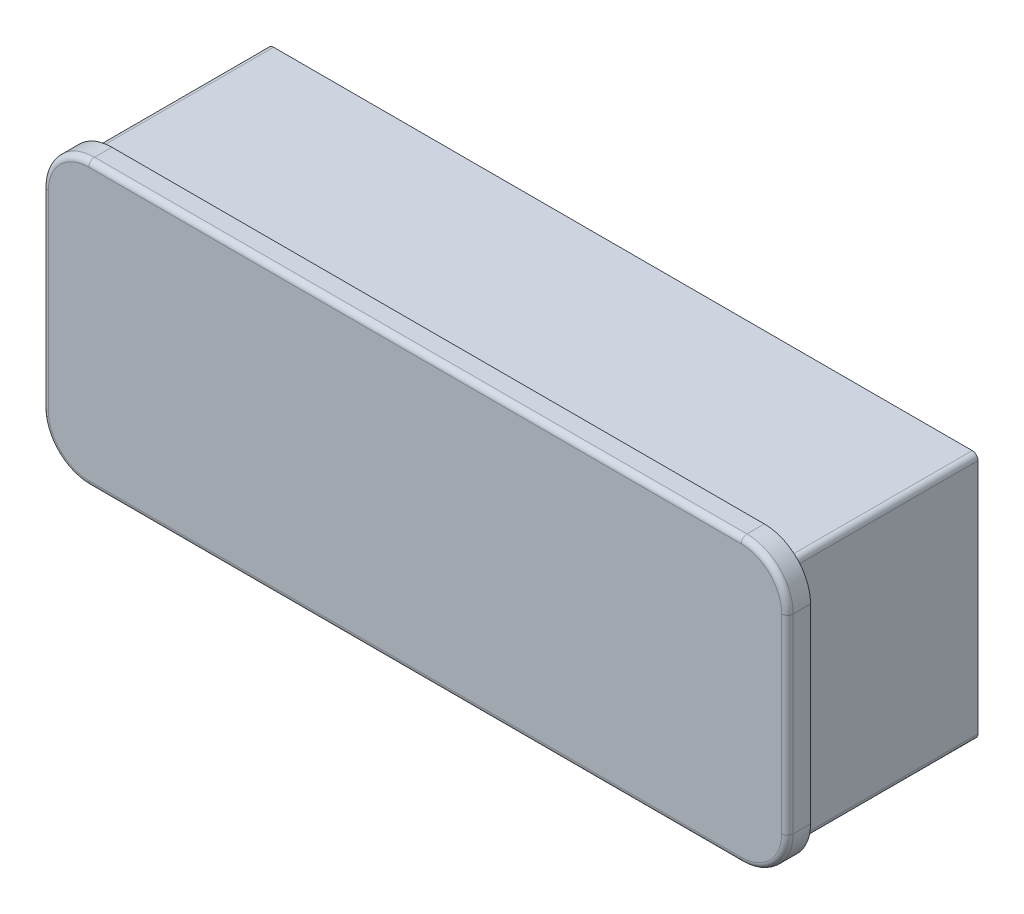
ISO-10303-21;
HEADER;
FILE_DESCRIPTION(('STEP AP214'),'2;1');
FILE_NAME('part.step','',(''),(''),'','','');
FILE_SCHEMA(('AUTOMOTIVE_DESIGN { 1 0 10303 214 1 1 1 1 }'));
ENDSEC;
DATA;
#1=APPLICATION_CONTEXT('core data for automotive mechanical design processes');
#2=APPLICATION_PROTOCOL_DEFINITION('international standard','automotive_design',2000,#1);
#3=PRODUCT_CONTEXT('',#1,'mechanical');
#4=PRODUCT('Part','Part','',(#3));
#5=PRODUCT_RELATED_PRODUCT_CATEGORY('part','',(#4));
#6=PRODUCT_DEFINITION_FORMATION('','',#4);
#7=PRODUCT_DEFINITION_CONTEXT('part definition',#1,'design');
#8=PRODUCT_DEFINITION('design','',#6,#7);
#9=PRODUCT_DEFINITION_SHAPE('','',#8);
#10=(LENGTH_UNIT() NAMED_UNIT(*) SI_UNIT(.MILLI.,.METRE.));
#11=(NAMED_UNIT(*) PLANE_ANGLE_UNIT() SI_UNIT($,.RADIAN.));
#12=(NAMED_UNIT(*) SI_UNIT($,.STERADIAN.) SOLID_ANGLE_UNIT());
#13=UNCERTAINTY_MEASURE_WITH_UNIT(LENGTH_MEASURE(1.E-05),#10,'distance_accuracy_value','');
#14=(GEOMETRIC_REPRESENTATION_CONTEXT(3) GLOBAL_UNCERTAINTY_ASSIGNED_CONTEXT((#13)) GLOBAL_UNIT_ASSIGNED_CONTEXT((#10,
#11,#12)) REPRESENTATION_CONTEXT('',''));
#15=CARTESIAN_POINT('',(0.,0.,0.));
#16=DIRECTION('',(0.,0.,1.));
#17=DIRECTION('',(1.,0.,0.));
#18=AXIS2_PLACEMENT_3D('',#15,#16,#17);
#19=CARTESIAN_POINT('',(0.,0.,0.));
#20=DIRECTION('',(0.,0.,1.));
#21=DIRECTION('',(1.,0.,0.));
#22=AXIS2_PLACEMENT_3D('',#19,#20,#21);
#23=PLANE('',#22);
#24=DIRECTION('',(0.,1.,0.));
#25=VECTOR('',#24,1.);
#26=CARTESIAN_POINT('',(15.373,32.627,0.));
#27=LINE('',#26,#25);
#28=CARTESIAN_POINT('',(15.373,32.877,0.));
#29=VERTEX_POINT('',#28);
#30=CARTESIAN_POINT('',(15.373,43.123,0.));
#31=VERTEX_POINT('',#30);
#32=EDGE_CURVE('E242',#29,#31,#27,.T.);
#33=ORIENTED_EDGE('',*,*,#32,.F.);
#34=CARTESIAN_POINT('',(15.123,32.877,0.));
#35=DIRECTION('',(0.,0.,1.));
#36=DIRECTION('',(1.,0.,0.));
#37=AXIS2_PLACEMENT_3D('',#34,#35,#36);
#38=CIRCLE('',#37,0.25);
#39=CARTESIAN_POINT('',(15.123,32.627,0.));
#40=VERTEX_POINT('',#39);
#41=EDGE_CURVE('E225',#29,#40,#38,.F.);
#42=ORIENTED_EDGE('',*,*,#41,.T.);
#43=DIRECTION('',(1.,0.,0.));
#44=VECTOR('',#43,1.);
#45=CARTESIAN_POINT('',(-15.373,32.627,0.));
#46=LINE('',#45,#44);
#47=CARTESIAN_POINT('',(-15.123,32.627,0.));
#48=VERTEX_POINT('',#47);
#49=EDGE_CURVE('E252',#48,#40,#46,.T.);
#50=ORIENTED_EDGE('',*,*,#49,.F.);
#51=CARTESIAN_POINT('',(-15.123,32.877,0.));
#52=DIRECTION('',(0.,0.,1.));
#53=DIRECTION('',(1.,0.,0.));
#54=AXIS2_PLACEMENT_3D('',#51,#52,#53);
#55=CIRCLE('',#54,0.25);
#56=CARTESIAN_POINT('',(-15.373,32.877,0.));
#57=VERTEX_POINT('',#56);
#58=EDGE_CURVE('E236',#48,#57,#55,.F.);
#59=ORIENTED_EDGE('',*,*,#58,.T.);
#60=DIRECTION('',(0.,-1.,0.));
#61=VECTOR('',#60,1.);
#62=CARTESIAN_POINT('',(-15.373,43.373,0.));
#63=LINE('',#62,#61);
#64=CARTESIAN_POINT('',(-15.373,43.123,0.));
#65=VERTEX_POINT('',#64);
#66=EDGE_CURVE('E257',#65,#57,#63,.T.);
#67=ORIENTED_EDGE('',*,*,#66,.F.);
#68=CARTESIAN_POINT('',(-15.123,43.123,0.));
#69=DIRECTION('',(0.,0.,1.));
#70=DIRECTION('',(1.,0.,0.));
#71=AXIS2_PLACEMENT_3D('',#68,#69,#70);
#72=CIRCLE('',#71,0.25);
#73=CARTESIAN_POINT('',(-15.123,43.373,0.));
#74=VERTEX_POINT('',#73);
#75=EDGE_CURVE('E264',#65,#74,#72,.F.);
#76=ORIENTED_EDGE('',*,*,#75,.T.);
#77=DIRECTION('',(-1.,0.,0.));
#78=VECTOR('',#77,1.);
#79=CARTESIAN_POINT('',(15.373,43.373,0.));
#80=LINE('',#79,#78);
#81=CARTESIAN_POINT('',(15.123,43.373,0.));
#82=VERTEX_POINT('',#81);
#83=EDGE_CURVE('E251',#82,#74,#80,.T.);
#84=ORIENTED_EDGE('',*,*,#83,.F.);
#85=CARTESIAN_POINT('',(15.123,43.123,0.));
#86=DIRECTION('',(0.,0.,1.));
#87=DIRECTION('',(1.,0.,0.));
#88=AXIS2_PLACEMENT_3D('',#85,#86,#87);
#89=CIRCLE('',#88,0.25);
#90=EDGE_CURVE('E246',#82,#31,#89,.F.);
#91=ORIENTED_EDGE('',*,*,#90,.T.);
#92=EDGE_LOOP('',(#33,#42,#50,#59,#67,#76,#84,#91));
#93=FACE_BOUND('',#92,.T.);
#94=DIRECTION('',(1.,0.,0.));
#95=VECTOR('',#94,1.);
#96=CARTESIAN_POINT('',(-14.623,33.377,0.));
#97=LINE('',#96,#95);
#98=CARTESIAN_POINT('',(-13.623,33.377,0.));
#99=VERTEX_POINT('',#98);
#100=CARTESIAN_POINT('',(13.623,33.377,0.));
#101=VERTEX_POINT('',#100);
#102=EDGE_CURVE('E426',#99,#101,#97,.T.);
#103=ORIENTED_EDGE('',*,*,#102,.T.);
#104=CARTESIAN_POINT('',(13.623,34.377,0.));
#105=DIRECTION('',(0.,0.,1.));
#106=DIRECTION('',(1.,0.,0.));
#107=AXIS2_PLACEMENT_3D('',#104,#105,#106);
#108=CIRCLE('',#107,1.);
#109=CARTESIAN_POINT('',(14.623,34.377,0.));
#110=VERTEX_POINT('',#109);
#111=EDGE_CURVE('E346',#101,#110,#108,.T.);
#112=ORIENTED_EDGE('',*,*,#111,.T.);
#113=DIRECTION('',(0.,1.,0.));
#114=VECTOR('',#113,1.);
#115=CARTESIAN_POINT('',(14.623,33.377,0.));
#116=LINE('',#115,#114);
#117=CARTESIAN_POINT('',(14.623,41.623,0.));
#118=VERTEX_POINT('',#117);
#119=EDGE_CURVE('E421',#110,#118,#116,.T.);
#120=ORIENTED_EDGE('',*,*,#119,.T.);
#121=CARTESIAN_POINT('',(13.623,41.623,0.));
#122=DIRECTION('',(0.,0.,1.));
#123=DIRECTION('',(1.,0.,0.));
#124=AXIS2_PLACEMENT_3D('',#121,#122,#123);
#125=CIRCLE('',#124,1.);
#126=CARTESIAN_POINT('',(13.623,42.623,0.));
#127=VERTEX_POINT('',#126);
#128=EDGE_CURVE('E344',#118,#127,#125,.T.);
#129=ORIENTED_EDGE('',*,*,#128,.T.);
#130=DIRECTION('',(-1.,0.,0.));
#131=VECTOR('',#130,1.);
#132=CARTESIAN_POINT('',(14.623,42.623,0.));
#133=LINE('',#132,#131);
#134=CARTESIAN_POINT('',(-13.623,42.623,0.));
#135=VERTEX_POINT('',#134);
#136=EDGE_CURVE('E437',#127,#135,#133,.T.);
#137=ORIENTED_EDGE('',*,*,#136,.T.);
#138=CARTESIAN_POINT('',(-13.623,41.623,0.));
#139=DIRECTION('',(0.,0.,1.));
#140=DIRECTION('',(1.,0.,0.));
#141=AXIS2_PLACEMENT_3D('',#138,#139,#140);
#142=CIRCLE('',#141,1.);
#143=CARTESIAN_POINT('',(-14.623,41.623,0.));
#144=VERTEX_POINT('',#143);
#145=EDGE_CURVE('E342',#135,#144,#142,.T.);
#146=ORIENTED_EDGE('',*,*,#145,.T.);
#147=DIRECTION('',(0.,-1.,0.));
#148=VECTOR('',#147,1.);
#149=CARTESIAN_POINT('',(-14.623,42.623,0.));
#150=LINE('',#149,#148);
#151=CARTESIAN_POINT('',(-14.623,34.377,0.));
#152=VERTEX_POINT('',#151);
#153=EDGE_CURVE('E440',#144,#152,#150,.T.);
#154=ORIENTED_EDGE('',*,*,#153,.T.);
#155=CARTESIAN_POINT('',(-13.623,34.377,0.));
#156=DIRECTION('',(0.,0.,1.));
#157=DIRECTION('',(1.,0.,0.));
#158=AXIS2_PLACEMENT_3D('',#155,#156,#157);
#159=CIRCLE('',#158,1.);
#160=EDGE_CURVE('E348',#152,#99,#159,.T.);
#161=ORIENTED_EDGE('',*,*,#160,.T.);
#162=EDGE_LOOP('',(#103,#112,#120,#129,#137,#146,#154,#161));
#163=FACE_BOUND('',#162,.T.);
#164=ADVANCED_FACE('F38',(#93,#163),#23,.F.);
#165=CARTESIAN_POINT('',(-15.373,43.373,8.));
#166=DIRECTION('',(1.,0.,0.));
#167=DIRECTION('',(0.,0.,-1.));
#168=AXIS2_PLACEMENT_3D('',#165,#166,#167);
#169=PLANE('',#168);
#170=ORIENTED_EDGE('',*,*,#66,.T.);
#171=DIRECTION('',(0.,0.,-1.));
#172=VECTOR('',#171,1.);
#173=CARTESIAN_POINT('',(-15.373,32.877,8.));
#174=LINE('',#173,#172);
#175=CARTESIAN_POINT('',(-15.373,32.877,8.));
#176=VERTEX_POINT('',#175);
#177=EDGE_CURVE('E273',#57,#176,#174,.F.);
#178=ORIENTED_EDGE('',*,*,#177,.T.);
#179=DIRECTION('',(0.,-1.,0.));
#180=VECTOR('',#179,1.);
#181=CARTESIAN_POINT('',(-15.373,43.373,8.));
#182=LINE('',#181,#180);
#183=CARTESIAN_POINT('',(-15.373,43.123,8.));
#184=VERTEX_POINT('',#183);
#185=EDGE_CURVE('E255',#184,#176,#182,.T.);
#186=ORIENTED_EDGE('',*,*,#185,.F.);
#187=DIRECTION('',(0.,0.,-1.));
#188=VECTOR('',#187,1.);
#189=CARTESIAN_POINT('',(-15.373,43.123,8.));
#190=LINE('',#189,#188);
#191=EDGE_CURVE('E270',#184,#65,#190,.T.);
#192=ORIENTED_EDGE('',*,*,#191,.T.);
#193=EDGE_LOOP('',(#170,#178,#186,#192));
#194=FACE_BOUND('',#193,.T.);
#195=ADVANCED_FACE('F456',(#194),#169,.F.);
#196=CARTESIAN_POINT('',(-15.373,32.627,8.));
#197=DIRECTION('',(0.,1.,0.));
#198=DIRECTION('',(0.,0.,1.));
#199=AXIS2_PLACEMENT_3D('',#196,#197,#198);
#200=PLANE('',#199);
#201=ORIENTED_EDGE('',*,*,#49,.T.);
#202=DIRECTION('',(0.,0.,-1.));
#203=VECTOR('',#202,1.);
#204=CARTESIAN_POINT('',(15.123,32.627,8.));
#205=LINE('',#204,#203);
#206=CARTESIAN_POINT('',(15.123,32.627,8.));
#207=VERTEX_POINT('',#206);
#208=EDGE_CURVE('E230',#40,#207,#205,.F.);
#209=ORIENTED_EDGE('',*,*,#208,.T.);
#210=DIRECTION('',(1.,0.,0.));
#211=VECTOR('',#210,1.);
#212=CARTESIAN_POINT('',(-15.373,32.627,8.));
#213=LINE('',#212,#211);
#214=CARTESIAN_POINT('',(-15.123,32.627,8.));
#215=VERTEX_POINT('',#214);
#216=EDGE_CURVE('E447',#215,#207,#213,.T.);
#217=ORIENTED_EDGE('',*,*,#216,.F.);
#218=DIRECTION('',(0.,0.,-1.));
#219=VECTOR('',#218,1.);
#220=CARTESIAN_POINT('',(-15.123,32.627,8.));
#221=LINE('',#220,#219);
#222=EDGE_CURVE('E235',#215,#48,#221,.T.);
#223=ORIENTED_EDGE('',*,*,#222,.T.);
#224=EDGE_LOOP('',(#201,#209,#217,#223));
#225=FACE_BOUND('',#224,.T.);
#226=ADVANCED_FACE('F467',(#225),#200,.F.);
#227=CARTESIAN_POINT('',(15.373,32.627,8.));
#228=DIRECTION('',(-1.,0.,0.));
#229=DIRECTION('',(0.,0.,1.));
#230=AXIS2_PLACEMENT_3D('',#227,#228,#229);
#231=PLANE('',#230);
#232=DIRECTION('',(0.,1.,0.));
#233=VECTOR('',#232,1.);
#234=CARTESIAN_POINT('',(15.373,32.627,8.));
#235=LINE('',#234,#233);
#236=CARTESIAN_POINT('',(15.373,32.877,8.));
#237=VERTEX_POINT('',#236);
#238=CARTESIAN_POINT('',(15.373,43.123,8.));
#239=VERTEX_POINT('',#238);
#240=EDGE_CURVE('E245',#237,#239,#235,.T.);
#241=ORIENTED_EDGE('',*,*,#240,.F.);
#242=DIRECTION('',(0.,0.,-1.));
#243=VECTOR('',#242,1.);
#244=CARTESIAN_POINT('',(15.373,32.877,8.));
#245=LINE('',#244,#243);
#246=EDGE_CURVE('E229',#237,#29,#245,.T.);
#247=ORIENTED_EDGE('',*,*,#246,.T.);
#248=ORIENTED_EDGE('',*,*,#32,.T.);
#249=DIRECTION('',(0.,0.,-1.));
#250=VECTOR('',#249,1.);
#251=CARTESIAN_POINT('',(15.373,43.123,8.));
#252=LINE('',#251,#250);
#253=EDGE_CURVE('E247',#31,#239,#252,.F.);
#254=ORIENTED_EDGE('',*,*,#253,.T.);
#255=EDGE_LOOP('',(#241,#247,#248,#254));
#256=FACE_BOUND('',#255,.T.);
#257=ADVANCED_FACE('F241',(#256),#231,.F.);
#258=CARTESIAN_POINT('',(15.373,43.373,8.));
#259=DIRECTION('',(0.,-1.,0.));
#260=DIRECTION('',(0.,0.,-1.));
#261=AXIS2_PLACEMENT_3D('',#258,#259,#260);
#262=PLANE('',#261);
#263=ORIENTED_EDGE('',*,*,#83,.T.);
#264=DIRECTION('',(0.,0.,-1.));
#265=VECTOR('',#264,1.);
#266=CARTESIAN_POINT('',(-15.123,43.373,8.));
#267=LINE('',#266,#265);
#268=CARTESIAN_POINT('',(-15.123,43.373,8.));
#269=VERTEX_POINT('',#268);
#270=EDGE_CURVE('E278',#74,#269,#267,.F.);
#271=ORIENTED_EDGE('',*,*,#270,.T.);
#272=DIRECTION('',(-1.,0.,0.));
#273=VECTOR('',#272,1.);
#274=CARTESIAN_POINT('',(15.373,43.373,8.));
#275=LINE('',#274,#273);
#276=CARTESIAN_POINT('',(15.123,43.373,8.));
#277=VERTEX_POINT('',#276);
#278=EDGE_CURVE('E261',#277,#269,#275,.T.);
#279=ORIENTED_EDGE('',*,*,#278,.F.);
#280=DIRECTION('',(0.,0.,-1.));
#281=VECTOR('',#280,1.);
#282=CARTESIAN_POINT('',(15.123,43.373,8.));
#283=LINE('',#282,#281);
#284=EDGE_CURVE('E275',#277,#82,#283,.T.);
#285=ORIENTED_EDGE('',*,*,#284,.T.);
#286=EDGE_LOOP('',(#263,#271,#279,#285));
#287=FACE_BOUND('',#286,.T.);
#288=ADVANCED_FACE('F474',(#287),#262,.F.);
#289=CARTESIAN_POINT('',(14.623,33.377,8.));
#290=DIRECTION('',(-1.,0.,0.));
#291=DIRECTION('',(0.,0.,1.));
#292=AXIS2_PLACEMENT_3D('',#289,#290,#291);
#293=PLANE('',#292);
#294=DIRECTION('',(0.,1.,0.));
#295=VECTOR('',#294,1.);
#296=CARTESIAN_POINT('',(14.623,33.377,8.));
#297=LINE('',#296,#295);
#298=CARTESIAN_POINT('',(14.623,34.377,8.));
#299=VERTEX_POINT('',#298);
#300=CARTESIAN_POINT('',(14.623,41.623,8.));
#301=VERTEX_POINT('',#300);
#302=EDGE_CURVE('E422',#299,#301,#297,.T.);
#303=ORIENTED_EDGE('',*,*,#302,.T.);
#304=DIRECTION('',(0.,0.,-1.));
#305=VECTOR('',#304,1.);
#306=CARTESIAN_POINT('',(14.623,41.623,0.));
#307=LINE('',#306,#305);
#308=EDGE_CURVE('E334',#301,#118,#307,.T.);
#309=ORIENTED_EDGE('',*,*,#308,.T.);
#310=ORIENTED_EDGE('',*,*,#119,.F.);
#311=DIRECTION('',(0.,0.,-1.));
#312=VECTOR('',#311,1.);
#313=CARTESIAN_POINT('',(14.623,34.377,8.));
#314=LINE('',#313,#312);
#315=EDGE_CURVE('E332',#110,#299,#314,.F.);
#316=ORIENTED_EDGE('',*,*,#315,.T.);
#317=EDGE_LOOP('',(#303,#309,#310,#316));
#318=FACE_BOUND('',#317,.T.);
#319=ADVANCED_FACE('F483',(#318),#293,.T.);
#320=CARTESIAN_POINT('',(14.623,42.623,8.));
#321=DIRECTION('',(0.,-1.,0.));
#322=DIRECTION('',(1.,0.,0.));
#323=AXIS2_PLACEMENT_3D('',#320,#321,#322);
#324=PLANE('',#323);
#325=DIRECTION('',(-1.,0.,0.));
#326=VECTOR('',#325,1.);
#327=CARTESIAN_POINT('',(14.623,42.623,8.));
#328=LINE('',#327,#326);
#329=CARTESIAN_POINT('',(13.623,42.623,8.));
#330=VERTEX_POINT('',#329);
#331=CARTESIAN_POINT('',(-13.623,42.623,8.));
#332=VERTEX_POINT('',#331);
#333=EDGE_CURVE('E425',#330,#332,#328,.T.);
#334=ORIENTED_EDGE('',*,*,#333,.T.);
#335=DIRECTION('',(0.,0.,-1.));
#336=VECTOR('',#335,1.);
#337=CARTESIAN_POINT('',(-13.623,42.623,0.));
#338=LINE('',#337,#336);
#339=EDGE_CURVE('E316',#332,#135,#338,.T.);
#340=ORIENTED_EDGE('',*,*,#339,.T.);
#341=ORIENTED_EDGE('',*,*,#136,.F.);
#342=DIRECTION('',(0.,0.,-1.));
#343=VECTOR('',#342,1.);
#344=CARTESIAN_POINT('',(13.623,42.623,8.));
#345=LINE('',#344,#343);
#346=EDGE_CURVE('E314',#127,#330,#345,.F.);
#347=ORIENTED_EDGE('',*,*,#346,.T.);
#348=EDGE_LOOP('',(#334,#340,#341,#347));
#349=FACE_BOUND('',#348,.T.);
#350=ADVANCED_FACE('F490',(#349),#324,.T.);
#351=CARTESIAN_POINT('',(-14.623,42.623,8.));
#352=DIRECTION('',(1.,0.,0.));
#353=DIRECTION('',(0.,1.,0.));
#354=AXIS2_PLACEMENT_3D('',#351,#352,#353);
#355=PLANE('',#354);
#356=ORIENTED_EDGE('',*,*,#153,.F.);
#357=DIRECTION('',(0.,0.,-1.));
#358=VECTOR('',#357,1.);
#359=CARTESIAN_POINT('',(-14.623,41.623,8.));
#360=LINE('',#359,#358);
#361=CARTESIAN_POINT('',(-14.623,41.623,8.));
#362=VERTEX_POINT('',#361);
#363=EDGE_CURVE('E322',#144,#362,#360,.F.);
#364=ORIENTED_EDGE('',*,*,#363,.T.);
#365=DIRECTION('',(0.,-1.,0.));
#366=VECTOR('',#365,1.);
#367=CARTESIAN_POINT('',(-14.623,42.623,8.));
#368=LINE('',#367,#366);
#369=CARTESIAN_POINT('',(-14.623,34.377,8.));
#370=VERTEX_POINT('',#369);
#371=EDGE_CURVE('E429',#362,#370,#368,.T.);
#372=ORIENTED_EDGE('',*,*,#371,.T.);
#373=DIRECTION('',(0.,0.,-1.));
#374=VECTOR('',#373,1.);
#375=CARTESIAN_POINT('',(-14.623,34.377,0.));
#376=LINE('',#375,#374);
#377=EDGE_CURVE('E319',#370,#152,#376,.T.);
#378=ORIENTED_EDGE('',*,*,#377,.T.);
#379=EDGE_LOOP('',(#356,#364,#372,#378));
#380=FACE_BOUND('',#379,.T.);
#381=ADVANCED_FACE('F623',(#380),#355,.T.);
#382=CARTESIAN_POINT('',(-14.623,33.377,8.));
#383=DIRECTION('',(0.,1.,0.));
#384=DIRECTION('',(0.,0.,1.));
#385=AXIS2_PLACEMENT_3D('',#382,#383,#384);
#386=PLANE('',#385);
#387=DIRECTION('',(1.,0.,0.));
#388=VECTOR('',#387,1.);
#389=CARTESIAN_POINT('',(-14.623,33.377,8.));
#390=LINE('',#389,#388);
#391=CARTESIAN_POINT('',(-13.623,33.377,8.));
#392=VERTEX_POINT('',#391);
#393=CARTESIAN_POINT('',(13.623,33.377,8.));
#394=VERTEX_POINT('',#393);
#395=EDGE_CURVE('E432',#392,#394,#390,.T.);
#396=ORIENTED_EDGE('',*,*,#395,.T.);
#397=DIRECTION('',(0.,0.,-1.));
#398=VECTOR('',#397,1.);
#399=CARTESIAN_POINT('',(13.623,33.377,0.));
#400=LINE('',#399,#398);
#401=EDGE_CURVE('E339',#394,#101,#400,.T.);
#402=ORIENTED_EDGE('',*,*,#401,.T.);
#403=ORIENTED_EDGE('',*,*,#102,.F.);
#404=DIRECTION('',(0.,0.,-1.));
#405=VECTOR('',#404,1.);
#406=CARTESIAN_POINT('',(-13.623,33.377,8.));
#407=LINE('',#406,#405);
#408=EDGE_CURVE('E337',#99,#392,#407,.F.);
#409=ORIENTED_EDGE('',*,*,#408,.T.);
#410=EDGE_LOOP('',(#396,#402,#403,#409));
#411=FACE_BOUND('',#410,.T.);
#412=ADVANCED_FACE('F619',(#411),#386,.T.);
#413=CARTESIAN_POINT('',(0.,0.,8.));
#414=DIRECTION('',(0.,0.,1.));
#415=DIRECTION('',(1.,0.,0.));
#416=AXIS2_PLACEMENT_3D('',#413,#414,#415);
#417=PLANE('',#416);
#418=ORIENTED_EDGE('',*,*,#371,.F.);
#419=CARTESIAN_POINT('',(-13.623,41.623,8.));
#420=DIRECTION('',(0.,0.,1.));
#421=DIRECTION('',(1.,0.,0.));
#422=AXIS2_PLACEMENT_3D('',#419,#420,#421);
#423=CIRCLE('',#422,1.);
#424=EDGE_CURVE('E330',#362,#332,#423,.F.);
#425=ORIENTED_EDGE('',*,*,#424,.T.);
#426=ORIENTED_EDGE('',*,*,#333,.F.);
#427=CARTESIAN_POINT('',(13.623,41.623,8.));
#428=DIRECTION('',(0.,0.,1.));
#429=DIRECTION('',(1.,0.,0.));
#430=AXIS2_PLACEMENT_3D('',#427,#428,#429);
#431=CIRCLE('',#430,1.);
#432=EDGE_CURVE('E328',#330,#301,#431,.F.);
#433=ORIENTED_EDGE('',*,*,#432,.T.);
#434=ORIENTED_EDGE('',*,*,#302,.F.);
#435=CARTESIAN_POINT('',(13.623,34.377,8.));
#436=DIRECTION('',(0.,0.,1.));
#437=DIRECTION('',(1.,0.,0.));
#438=AXIS2_PLACEMENT_3D('',#435,#436,#437);
#439=CIRCLE('',#438,1.);
#440=EDGE_CURVE('E326',#299,#394,#439,.F.);
#441=ORIENTED_EDGE('',*,*,#440,.T.);
#442=ORIENTED_EDGE('',*,*,#395,.F.);
#443=CARTESIAN_POINT('',(-13.623,34.377,8.));
#444=DIRECTION('',(0.,0.,1.));
#445=DIRECTION('',(1.,0.,0.));
#446=AXIS2_PLACEMENT_3D('',#443,#444,#445);
#447=CIRCLE('',#446,1.);
#448=EDGE_CURVE('E324',#392,#370,#447,.F.);
#449=ORIENTED_EDGE('',*,*,#448,.T.);
#450=EDGE_LOOP('',(#418,#425,#426,#433,#434,#441,#442,#449));
#451=FACE_BOUND('',#450,.T.);
#452=ADVANCED_FACE('F622',(#451),#417,.F.);
#453=DIRECTION('',(-1.,0.,0.));
#454=VECTOR('',#453,1.);
#455=CARTESIAN_POINT('',(16.123,44.123,8.));
#456=LINE('',#455,#454);
#457=CARTESIAN_POINT('',(14.123,44.123,8.));
#458=VERTEX_POINT('',#457);
#459=CARTESIAN_POINT('',(-14.123,44.123,8.));
#460=VERTEX_POINT('',#459);
#461=EDGE_CURVE('E413',#458,#460,#456,.T.);
#462=ORIENTED_EDGE('',*,*,#461,.F.);
#463=CARTESIAN_POINT('',(14.123,42.123,8.));
#464=DIRECTION('',(0.,0.,1.));
#465=DIRECTION('',(1.,0.,0.));
#466=AXIS2_PLACEMENT_3D('',#463,#464,#465);
#467=CIRCLE('',#466,2.);
#468=CARTESIAN_POINT('',(16.123,42.123,8.));
#469=VERTEX_POINT('',#468);
#470=EDGE_CURVE('E298',#458,#469,#467,.F.);
#471=ORIENTED_EDGE('',*,*,#470,.T.);
#472=DIRECTION('',(0.,1.,0.));
#473=VECTOR('',#472,1.);
#474=CARTESIAN_POINT('',(16.123,31.877,8.));
#475=LINE('',#474,#473);
#476=CARTESIAN_POINT('',(16.123,33.877,8.));
#477=VERTEX_POINT('',#476);
#478=EDGE_CURVE('E407',#477,#469,#475,.T.);
#479=ORIENTED_EDGE('',*,*,#478,.F.);
#480=CARTESIAN_POINT('',(14.123,33.877,8.));
#481=DIRECTION('',(0.,0.,1.));
#482=DIRECTION('',(1.,0.,0.));
#483=AXIS2_PLACEMENT_3D('',#480,#481,#482);
#484=CIRCLE('',#483,2.);
#485=CARTESIAN_POINT('',(14.123,31.877,8.));
#486=VERTEX_POINT('',#485);
#487=EDGE_CURVE('E296',#477,#486,#484,.F.);
#488=ORIENTED_EDGE('',*,*,#487,.T.);
#489=DIRECTION('',(1.,0.,0.));
#490=VECTOR('',#489,1.);
#491=CARTESIAN_POINT('',(-16.123,31.877,8.));
#492=LINE('',#491,#490);
#493=CARTESIAN_POINT('',(-14.123,31.877,8.));
#494=VERTEX_POINT('',#493);
#495=EDGE_CURVE('E401',#494,#486,#492,.T.);
#496=ORIENTED_EDGE('',*,*,#495,.F.);
#497=CARTESIAN_POINT('',(-14.123,33.877,8.));
#498=DIRECTION('',(0.,0.,1.));
#499=DIRECTION('',(1.,0.,0.));
#500=AXIS2_PLACEMENT_3D('',#497,#498,#499);
#501=CIRCLE('',#500,2.);
#502=CARTESIAN_POINT('',(-16.123,33.877,8.));
#503=VERTEX_POINT('',#502);
#504=EDGE_CURVE('E294',#494,#503,#501,.F.);
#505=ORIENTED_EDGE('',*,*,#504,.T.);
#506=DIRECTION('',(0.,-1.,0.));
#507=VECTOR('',#506,1.);
#508=CARTESIAN_POINT('',(-16.123,44.123,8.));
#509=LINE('',#508,#507);
#510=CARTESIAN_POINT('',(-16.123,42.123,8.));
#511=VERTEX_POINT('',#510);
#512=EDGE_CURVE('E418',#511,#503,#509,.T.);
#513=ORIENTED_EDGE('',*,*,#512,.F.);
#514=CARTESIAN_POINT('',(-14.123,42.123,8.));
#515=DIRECTION('',(0.,0.,1.));
#516=DIRECTION('',(1.,0.,0.));
#517=AXIS2_PLACEMENT_3D('',#514,#515,#516);
#518=CIRCLE('',#517,2.);
#519=EDGE_CURVE('E292',#511,#460,#518,.F.);
#520=ORIENTED_EDGE('',*,*,#519,.T.);
#521=EDGE_LOOP('',(#462,#471,#479,#488,#496,#505,#513,#520));
#522=FACE_BOUND('',#521,.T.);
#523=ORIENTED_EDGE('',*,*,#240,.T.);
#524=CARTESIAN_POINT('',(15.123,43.123,8.));
#525=DIRECTION('',(0.,0.,1.));
#526=DIRECTION('',(1.,0.,0.));
#527=AXIS2_PLACEMENT_3D('',#524,#525,#526);
#528=CIRCLE('',#527,0.25);
#529=EDGE_CURVE('E286',#239,#277,#528,.T.);
#530=ORIENTED_EDGE('',*,*,#529,.T.);
#531=ORIENTED_EDGE('',*,*,#278,.T.);
#532=CARTESIAN_POINT('',(-15.123,43.123,8.));
#533=DIRECTION('',(0.,0.,1.));
#534=DIRECTION('',(1.,0.,0.));
#535=AXIS2_PLACEMENT_3D('',#532,#533,#534);
#536=CIRCLE('',#535,0.25);
#537=EDGE_CURVE('E284',#269,#184,#536,.T.);
#538=ORIENTED_EDGE('',*,*,#537,.T.);
#539=ORIENTED_EDGE('',*,*,#185,.T.);
#540=CARTESIAN_POINT('',(-15.123,32.877,8.));
#541=DIRECTION('',(0.,0.,1.));
#542=DIRECTION('',(1.,0.,0.));
#543=AXIS2_PLACEMENT_3D('',#540,#541,#542);
#544=CIRCLE('',#543,0.25);
#545=EDGE_CURVE('E282',#176,#215,#544,.T.);
#546=ORIENTED_EDGE('',*,*,#545,.T.);
#547=ORIENTED_EDGE('',*,*,#216,.T.);
#548=CARTESIAN_POINT('',(15.123,32.877,8.));
#549=DIRECTION('',(0.,0.,1.));
#550=DIRECTION('',(1.,0.,0.));
#551=AXIS2_PLACEMENT_3D('',#548,#549,#550);
#552=CIRCLE('',#551,0.25);
#553=EDGE_CURVE('E280',#207,#237,#552,.T.);
#554=ORIENTED_EDGE('',*,*,#553,.T.);
#555=EDGE_LOOP('',(#523,#530,#531,#538,#539,#546,#547,#554));
#556=FACE_BOUND('',#555,.T.);
#557=ADVANCED_FACE('F465',(#522,#556),#417,.F.);
#558=CARTESIAN_POINT('',(-16.123,31.877,9.));
#559=DIRECTION('',(0.,1.,0.));
#560=DIRECTION('',(0.,0.,1.));
#561=AXIS2_PLACEMENT_3D('',#558,#559,#560);
#562=PLANE('',#561);
#563=DIRECTION('',(0.,0.,-1.));
#564=VECTOR('',#563,1.);
#565=CARTESIAN_POINT('',(14.123,31.877,9.));
#566=LINE('',#565,#564);
#567=CARTESIAN_POINT('',(14.123,31.877,8.75));
#568=VERTEX_POINT('',#567);
#569=EDGE_CURVE('E306',#486,#568,#566,.F.);
#570=ORIENTED_EDGE('',*,*,#569,.T.);
#571=DIRECTION('',(1.,0.,0.));
#572=VECTOR('',#571,1.);
#573=CARTESIAN_POINT('',(-14.123,31.877,8.75));
#574=LINE('',#573,#572);
#575=CARTESIAN_POINT('',(-14.123,31.877,8.75));
#576=VERTEX_POINT('',#575);
#577=EDGE_CURVE('E370',#568,#576,#574,.F.);
#578=ORIENTED_EDGE('',*,*,#577,.T.);
#579=DIRECTION('',(0.,0.,-1.));
#580=VECTOR('',#579,1.);
#581=CARTESIAN_POINT('',(-14.123,31.877,9.));
#582=LINE('',#581,#580);
#583=EDGE_CURVE('E304',#576,#494,#582,.T.);
#584=ORIENTED_EDGE('',*,*,#583,.T.);
#585=ORIENTED_EDGE('',*,*,#495,.T.);
#586=EDGE_LOOP('',(#570,#578,#584,#585));
#587=FACE_BOUND('',#586,.T.);
#588=ADVANCED_FACE('F590',(#587),#562,.F.);
#589=CARTESIAN_POINT('',(16.123,31.877,9.));
#590=DIRECTION('',(-1.,0.,0.));
#591=DIRECTION('',(0.,0.,1.));
#592=AXIS2_PLACEMENT_3D('',#589,#590,#591);
#593=PLANE('',#592);
#594=DIRECTION('',(0.,0.,-1.));
#595=VECTOR('',#594,1.);
#596=CARTESIAN_POINT('',(16.123,42.123,9.));
#597=LINE('',#596,#595);
#598=CARTESIAN_POINT('',(16.123,42.123,8.75));
#599=VERTEX_POINT('',#598);
#600=EDGE_CURVE('E302',#469,#599,#597,.F.);
#601=ORIENTED_EDGE('',*,*,#600,.T.);
#602=DIRECTION('',(0.,1.,0.));
#603=VECTOR('',#602,1.);
#604=CARTESIAN_POINT('',(16.123,33.877,8.75));
#605=LINE('',#604,#603);
#606=CARTESIAN_POINT('',(16.123,33.877,8.75));
#607=VERTEX_POINT('',#606);
#608=EDGE_CURVE('E11',#599,#607,#605,.F.);
#609=ORIENTED_EDGE('',*,*,#608,.T.);
#610=DIRECTION('',(0.,0.,-1.));
#611=VECTOR('',#610,1.);
#612=CARTESIAN_POINT('',(16.123,33.877,9.));
#613=LINE('',#612,#611);
#614=EDGE_CURVE('E300',#607,#477,#613,.T.);
#615=ORIENTED_EDGE('',*,*,#614,.T.);
#616=ORIENTED_EDGE('',*,*,#478,.T.);
#617=EDGE_LOOP('',(#601,#609,#615,#616));
#618=FACE_BOUND('',#617,.T.);
#619=ADVANCED_FACE('F580',(#618),#593,.F.);
#620=CARTESIAN_POINT('',(16.123,44.123,9.));
#621=DIRECTION('',(0.,-1.,0.));
#622=DIRECTION('',(0.,0.,-1.));
#623=AXIS2_PLACEMENT_3D('',#620,#621,#622);
#624=PLANE('',#623);
#625=DIRECTION('',(0.,0.,-1.));
#626=VECTOR('',#625,1.);
#627=CARTESIAN_POINT('',(-14.123,44.123,9.));
#628=LINE('',#627,#626);
#629=CARTESIAN_POINT('',(-14.123,44.123,8.75));
#630=VERTEX_POINT('',#629);
#631=EDGE_CURVE('E288',#460,#630,#628,.F.);
#632=ORIENTED_EDGE('',*,*,#631,.T.);
#633=DIRECTION('',(-1.,0.,0.));
#634=VECTOR('',#633,1.);
#635=CARTESIAN_POINT('',(14.123,44.123,8.75));
#636=LINE('',#635,#634);
#637=CARTESIAN_POINT('',(14.123,44.123,8.75));
#638=VERTEX_POINT('',#637);
#639=EDGE_CURVE('E62',#630,#638,#636,.F.);
#640=ORIENTED_EDGE('',*,*,#639,.T.);
#641=DIRECTION('',(0.,0.,-1.));
#642=VECTOR('',#641,1.);
#643=CARTESIAN_POINT('',(14.123,44.123,9.));
#644=LINE('',#643,#642);
#645=EDGE_CURVE('E290',#638,#458,#644,.T.);
#646=ORIENTED_EDGE('',*,*,#645,.T.);
#647=ORIENTED_EDGE('',*,*,#461,.T.);
#648=EDGE_LOOP('',(#632,#640,#646,#647));
#649=FACE_BOUND('',#648,.T.);
#650=ADVANCED_FACE('F605',(#649),#624,.F.);
#651=CARTESIAN_POINT('',(-16.123,44.123,9.));
#652=DIRECTION('',(1.,0.,0.));
#653=DIRECTION('',(0.,0.,-1.));
#654=AXIS2_PLACEMENT_3D('',#651,#652,#653);
#655=PLANE('',#654);
#656=DIRECTION('',(0.,0.,-1.));
#657=VECTOR('',#656,1.);
#658=CARTESIAN_POINT('',(-16.123,33.877,9.));
#659=LINE('',#658,#657);
#660=CARTESIAN_POINT('',(-16.123,33.877,8.75));
#661=VERTEX_POINT('',#660);
#662=EDGE_CURVE('E311',#503,#661,#659,.F.);
#663=ORIENTED_EDGE('',*,*,#662,.T.);
#664=DIRECTION('',(0.,-1.,0.));
#665=VECTOR('',#664,1.);
#666=CARTESIAN_POINT('',(-16.123,42.123,8.75));
#667=LINE('',#666,#665);
#668=CARTESIAN_POINT('',(-16.123,42.123,8.75));
#669=VERTEX_POINT('',#668);
#670=EDGE_CURVE('E374',#661,#669,#667,.F.);
#671=ORIENTED_EDGE('',*,*,#670,.T.);
#672=DIRECTION('',(0.,0.,-1.));
#673=VECTOR('',#672,1.);
#674=CARTESIAN_POINT('',(-16.123,42.123,9.));
#675=LINE('',#674,#673);
#676=EDGE_CURVE('E309',#669,#511,#675,.T.);
#677=ORIENTED_EDGE('',*,*,#676,.T.);
#678=ORIENTED_EDGE('',*,*,#512,.T.);
#679=EDGE_LOOP('',(#663,#671,#677,#678));
#680=FACE_BOUND('',#679,.T.);
#681=ADVANCED_FACE('F598',(#680),#655,.F.);
#682=CARTESIAN_POINT('',(0.,0.,9.));
#683=DIRECTION('',(0.,0.,1.));
#684=DIRECTION('',(1.,0.,0.));
#685=AXIS2_PLACEMENT_3D('',#682,#683,#684);
#686=PLANE('',#685);
#687=DIRECTION('',(1.,0.,0.));
#688=VECTOR('',#687,1.);
#689=CARTESIAN_POINT('',(14.123,32.127,9.));
#690=LINE('',#689,#688);
#691=CARTESIAN_POINT('',(-14.123,32.127,9.));
#692=VERTEX_POINT('',#691);
#693=CARTESIAN_POINT('',(14.123,32.127,9.));
#694=VERTEX_POINT('',#693);
#695=EDGE_CURVE('E362',#692,#694,#690,.T.);
#696=ORIENTED_EDGE('',*,*,#695,.T.);
#697=CARTESIAN_POINT('',(14.123,33.877,9.));
#698=DIRECTION('',(0.,0.,1.));
#699=DIRECTION('',(1.,0.,0.));
#700=AXIS2_PLACEMENT_3D('',#697,#698,#699);
#701=CIRCLE('',#700,1.75);
#702=CARTESIAN_POINT('',(15.873,33.877,9.));
#703=VERTEX_POINT('',#702);
#704=EDGE_CURVE('E364',#694,#703,#701,.T.);
#705=ORIENTED_EDGE('',*,*,#704,.T.);
#706=DIRECTION('',(0.,1.,0.));
#707=VECTOR('',#706,1.);
#708=CARTESIAN_POINT('',(15.873,42.123,9.));
#709=LINE('',#708,#707);
#710=CARTESIAN_POINT('',(15.873,42.123,9.));
#711=VERTEX_POINT('',#710);
#712=EDGE_CURVE('E350',#703,#711,#709,.T.);
#713=ORIENTED_EDGE('',*,*,#712,.T.);
#714=CARTESIAN_POINT('',(14.123,42.123,9.));
#715=DIRECTION('',(0.,0.,1.));
#716=DIRECTION('',(1.,0.,0.));
#717=AXIS2_PLACEMENT_3D('',#714,#715,#716);
#718=CIRCLE('',#717,1.75);
#719=CARTESIAN_POINT('',(14.123,43.873,9.));
#720=VERTEX_POINT('',#719);
#721=EDGE_CURVE('E352',#711,#720,#718,.T.);
#722=ORIENTED_EDGE('',*,*,#721,.T.);
#723=DIRECTION('',(-1.,0.,0.));
#724=VECTOR('',#723,1.);
#725=CARTESIAN_POINT('',(-14.123,43.873,9.));
#726=LINE('',#725,#724);
#727=CARTESIAN_POINT('',(-14.123,43.873,9.));
#728=VERTEX_POINT('',#727);
#729=EDGE_CURVE('E354',#720,#728,#726,.T.);
#730=ORIENTED_EDGE('',*,*,#729,.T.);
#731=CARTESIAN_POINT('',(-14.123,42.123,9.));
#732=DIRECTION('',(0.,0.,1.));
#733=DIRECTION('',(1.,0.,0.));
#734=AXIS2_PLACEMENT_3D('',#731,#732,#733);
#735=CIRCLE('',#734,1.75);
#736=CARTESIAN_POINT('',(-15.873,42.123,9.));
#737=VERTEX_POINT('',#736);
#738=EDGE_CURVE('E356',#728,#737,#735,.T.);
#739=ORIENTED_EDGE('',*,*,#738,.T.);
#740=DIRECTION('',(0.,-1.,0.));
#741=VECTOR('',#740,1.);
#742=CARTESIAN_POINT('',(-15.873,33.877,9.));
#743=LINE('',#742,#741);
#744=CARTESIAN_POINT('',(-15.873,33.877,9.));
#745=VERTEX_POINT('',#744);
#746=EDGE_CURVE('E358',#737,#745,#743,.T.);
#747=ORIENTED_EDGE('',*,*,#746,.T.);
#748=CARTESIAN_POINT('',(-14.123,33.877,9.));
#749=DIRECTION('',(0.,0.,1.));
#750=DIRECTION('',(1.,0.,0.));
#751=AXIS2_PLACEMENT_3D('',#748,#749,#750);
#752=CIRCLE('',#751,1.75);
#753=EDGE_CURVE('E360',#745,#692,#752,.T.);
#754=ORIENTED_EDGE('',*,*,#753,.T.);
#755=EDGE_LOOP('',(#696,#705,#713,#722,#730,#739,#747,#754));
#756=FACE_BOUND('',#755,.T.);
#757=ADVANCED_FACE('F612',(#756),#686,.T.);
#758=CARTESIAN_POINT('',(15.123,32.877,8.));
#759=DIRECTION('',(0.,0.,-1.));
#760=DIRECTION('',(-1.,0.,0.));
#761=AXIS2_PLACEMENT_3D('',#758,#759,#760);
#762=CYLINDRICAL_SURFACE('',#761,0.25);
#763=ORIENTED_EDGE('',*,*,#553,.F.);
#764=ORIENTED_EDGE('',*,*,#208,.F.);
#765=ORIENTED_EDGE('',*,*,#41,.F.);
#766=ORIENTED_EDGE('',*,*,#246,.F.);
#767=EDGE_LOOP('',(#763,#764,#765,#766));
#768=FACE_BOUND('',#767,.T.);
#769=ADVANCED_FACE('F228',(#768),#762,.T.);
#770=CARTESIAN_POINT('',(-15.123,32.877,8.));
#771=DIRECTION('',(0.,0.,-1.));
#772=DIRECTION('',(-1.,0.,0.));
#773=AXIS2_PLACEMENT_3D('',#770,#771,#772);
#774=CYLINDRICAL_SURFACE('',#773,0.25);
#775=ORIENTED_EDGE('',*,*,#545,.F.);
#776=ORIENTED_EDGE('',*,*,#177,.F.);
#777=ORIENTED_EDGE('',*,*,#58,.F.);
#778=ORIENTED_EDGE('',*,*,#222,.F.);
#779=EDGE_LOOP('',(#775,#776,#777,#778));
#780=FACE_BOUND('',#779,.T.);
#781=ADVANCED_FACE('F461',(#780),#774,.T.);
#782=CARTESIAN_POINT('',(-15.123,43.123,8.));
#783=DIRECTION('',(0.,0.,-1.));
#784=DIRECTION('',(-1.,0.,0.));
#785=AXIS2_PLACEMENT_3D('',#782,#783,#784);
#786=CYLINDRICAL_SURFACE('',#785,0.25);
#787=ORIENTED_EDGE('',*,*,#537,.F.);
#788=ORIENTED_EDGE('',*,*,#270,.F.);
#789=ORIENTED_EDGE('',*,*,#75,.F.);
#790=ORIENTED_EDGE('',*,*,#191,.F.);
#791=EDGE_LOOP('',(#787,#788,#789,#790));
#792=FACE_BOUND('',#791,.T.);
#793=ADVANCED_FACE('F497',(#792),#786,.T.);
#794=CARTESIAN_POINT('',(15.123,43.123,8.));
#795=DIRECTION('',(0.,0.,-1.));
#796=DIRECTION('',(-1.,0.,0.));
#797=AXIS2_PLACEMENT_3D('',#794,#795,#796);
#798=CYLINDRICAL_SURFACE('',#797,0.25);
#799=ORIENTED_EDGE('',*,*,#529,.F.);
#800=ORIENTED_EDGE('',*,*,#253,.F.);
#801=ORIENTED_EDGE('',*,*,#90,.F.);
#802=ORIENTED_EDGE('',*,*,#284,.F.);
#803=EDGE_LOOP('',(#799,#800,#801,#802));
#804=FACE_BOUND('',#803,.T.);
#805=ADVANCED_FACE('F500',(#804),#798,.T.);
#806=CARTESIAN_POINT('',(14.123,42.123,9.));
#807=DIRECTION('',(0.,0.,-1.));
#808=DIRECTION('',(-1.,0.,0.));
#809=AXIS2_PLACEMENT_3D('',#806,#807,#808);
#810=CYLINDRICAL_SURFACE('',#809,2.);
#811=ORIENTED_EDGE('',*,*,#645,.F.);
#812=CARTESIAN_POINT('',(14.123,42.123,8.75));
#813=DIRECTION('',(0.,0.,1.));
#814=DIRECTION('',(1.,0.,0.));
#815=AXIS2_PLACEMENT_3D('',#812,#813,#814);
#816=CIRCLE('',#815,2.);
#817=EDGE_CURVE('E47',#638,#599,#816,.F.);
#818=ORIENTED_EDGE('',*,*,#817,.T.);
#819=ORIENTED_EDGE('',*,*,#600,.F.);
#820=ORIENTED_EDGE('',*,*,#470,.F.);
#821=EDGE_LOOP('',(#811,#818,#819,#820));
#822=FACE_BOUND('',#821,.T.);
#823=ADVANCED_FACE('F502',(#822),#810,.T.);
#824=CARTESIAN_POINT('',(14.123,33.877,9.));
#825=DIRECTION('',(0.,0.,-1.));
#826=DIRECTION('',(-1.,0.,0.));
#827=AXIS2_PLACEMENT_3D('',#824,#825,#826);
#828=CYLINDRICAL_SURFACE('',#827,2.);
#829=ORIENTED_EDGE('',*,*,#614,.F.);
#830=CARTESIAN_POINT('',(14.123,33.877,8.75));
#831=DIRECTION('',(0.,0.,1.));
#832=DIRECTION('',(1.,0.,0.));
#833=AXIS2_PLACEMENT_3D('',#830,#831,#832);
#834=CIRCLE('',#833,2.);
#835=EDGE_CURVE('E367',#607,#568,#834,.F.);
#836=ORIENTED_EDGE('',*,*,#835,.T.);
#837=ORIENTED_EDGE('',*,*,#569,.F.);
#838=ORIENTED_EDGE('',*,*,#487,.F.);
#839=EDGE_LOOP('',(#829,#836,#837,#838));
#840=FACE_BOUND('',#839,.T.);
#841=ADVANCED_FACE('F508',(#840),#828,.T.);
#842=CARTESIAN_POINT('',(-14.123,33.877,9.));
#843=DIRECTION('',(0.,0.,-1.));
#844=DIRECTION('',(-1.,0.,0.));
#845=AXIS2_PLACEMENT_3D('',#842,#843,#844);
#846=CYLINDRICAL_SURFACE('',#845,2.);
#847=ORIENTED_EDGE('',*,*,#583,.F.);
#848=CARTESIAN_POINT('',(-14.123,33.877,8.75));
#849=DIRECTION('',(0.,0.,1.));
#850=DIRECTION('',(1.,0.,0.));
#851=AXIS2_PLACEMENT_3D('',#848,#849,#850);
#852=CIRCLE('',#851,2.);
#853=EDGE_CURVE('E372',#576,#661,#852,.F.);
#854=ORIENTED_EDGE('',*,*,#853,.T.);
#855=ORIENTED_EDGE('',*,*,#662,.F.);
#856=ORIENTED_EDGE('',*,*,#504,.F.);
#857=EDGE_LOOP('',(#847,#854,#855,#856));
#858=FACE_BOUND('',#857,.T.);
#859=ADVANCED_FACE('F515',(#858),#846,.T.);
#860=CARTESIAN_POINT('',(-14.123,42.123,9.));
#861=DIRECTION('',(0.,0.,-1.));
#862=DIRECTION('',(-1.,0.,0.));
#863=AXIS2_PLACEMENT_3D('',#860,#861,#862);
#864=CYLINDRICAL_SURFACE('',#863,2.);
#865=ORIENTED_EDGE('',*,*,#676,.F.);
#866=CARTESIAN_POINT('',(-14.123,42.123,8.75));
#867=DIRECTION('',(0.,0.,1.));
#868=DIRECTION('',(1.,0.,0.));
#869=AXIS2_PLACEMENT_3D('',#866,#867,#868);
#870=CIRCLE('',#869,2.);
#871=EDGE_CURVE('E376',#669,#630,#870,.F.);
#872=ORIENTED_EDGE('',*,*,#871,.T.);
#873=ORIENTED_EDGE('',*,*,#631,.F.);
#874=ORIENTED_EDGE('',*,*,#519,.F.);
#875=EDGE_LOOP('',(#865,#872,#873,#874));
#876=FACE_BOUND('',#875,.T.);
#877=ADVANCED_FACE('F519',(#876),#864,.T.);
#878=CARTESIAN_POINT('',(-13.623,41.623,8.));
#879=DIRECTION('',(0.,0.,1.));
#880=DIRECTION('',(1.,0.,0.));
#881=AXIS2_PLACEMENT_3D('',#878,#879,#880);
#882=CYLINDRICAL_SURFACE('',#881,1.);
#883=ORIENTED_EDGE('',*,*,#424,.F.);
#884=ORIENTED_EDGE('',*,*,#363,.F.);
#885=ORIENTED_EDGE('',*,*,#145,.F.);
#886=ORIENTED_EDGE('',*,*,#339,.F.);
#887=EDGE_LOOP('',(#883,#884,#885,#886));
#888=FACE_BOUND('',#887,.T.);
#889=ADVANCED_FACE('F523',(#888),#882,.F.);
#890=CARTESIAN_POINT('',(13.623,41.623,8.));
#891=DIRECTION('',(0.,0.,1.));
#892=DIRECTION('',(1.,0.,0.));
#893=AXIS2_PLACEMENT_3D('',#890,#891,#892);
#894=CYLINDRICAL_SURFACE('',#893,1.);
#895=ORIENTED_EDGE('',*,*,#432,.F.);
#896=ORIENTED_EDGE('',*,*,#346,.F.);
#897=ORIENTED_EDGE('',*,*,#128,.F.);
#898=ORIENTED_EDGE('',*,*,#308,.F.);
#899=EDGE_LOOP('',(#895,#896,#897,#898));
#900=FACE_BOUND('',#899,.T.);
#901=ADVANCED_FACE('F527',(#900),#894,.F.);
#902=CARTESIAN_POINT('',(13.623,34.377,8.));
#903=DIRECTION('',(0.,0.,1.));
#904=DIRECTION('',(1.,0.,0.));
#905=AXIS2_PLACEMENT_3D('',#902,#903,#904);
#906=CYLINDRICAL_SURFACE('',#905,1.);
#907=ORIENTED_EDGE('',*,*,#440,.F.);
#908=ORIENTED_EDGE('',*,*,#315,.F.);
#909=ORIENTED_EDGE('',*,*,#111,.F.);
#910=ORIENTED_EDGE('',*,*,#401,.F.);
#911=EDGE_LOOP('',(#907,#908,#909,#910));
#912=FACE_BOUND('',#911,.T.);
#913=ADVANCED_FACE('F531',(#912),#906,.F.);
#914=CARTESIAN_POINT('',(-13.623,34.377,8.));
#915=DIRECTION('',(0.,0.,1.));
#916=DIRECTION('',(1.,0.,0.));
#917=AXIS2_PLACEMENT_3D('',#914,#915,#916);
#918=CYLINDRICAL_SURFACE('',#917,1.);
#919=ORIENTED_EDGE('',*,*,#448,.F.);
#920=ORIENTED_EDGE('',*,*,#408,.F.);
#921=ORIENTED_EDGE('',*,*,#160,.F.);
#922=ORIENTED_EDGE('',*,*,#377,.F.);
#923=EDGE_LOOP('',(#919,#920,#921,#922));
#924=FACE_BOUND('',#923,.T.);
#925=ADVANCED_FACE('F535',(#924),#918,.F.);
#926=CARTESIAN_POINT('',(-14.123,42.123,8.75));
#927=DIRECTION('',(0.,0.,1.));
#928=DIRECTION('',(1.,0.,0.));
#929=AXIS2_PLACEMENT_3D('',#926,#927,#928);
#930=TOROIDAL_SURFACE('',#929,1.75,0.25);
#931=CARTESIAN_POINT('',(-14.123,43.873,8.75));
#932=DIRECTION('',(1.,0.,0.));
#933=DIRECTION('',(0.,0.,-1.));
#934=AXIS2_PLACEMENT_3D('',#931,#932,#933);
#935=CIRCLE('',#934,0.25);
#936=EDGE_CURVE('E395',#630,#728,#935,.T.);
#937=ORIENTED_EDGE('',*,*,#936,.F.);
#938=ORIENTED_EDGE('',*,*,#871,.F.);
#939=CARTESIAN_POINT('',(-15.873,42.123,8.75));
#940=DIRECTION('',(0.,-1.,0.));
#941=DIRECTION('',(0.,0.,-1.));
#942=AXIS2_PLACEMENT_3D('',#939,#940,#941);
#943=CIRCLE('',#942,0.25);
#944=EDGE_CURVE('E42',#737,#669,#943,.T.);
#945=ORIENTED_EDGE('',*,*,#944,.F.);
#946=ORIENTED_EDGE('',*,*,#738,.F.);
#947=EDGE_LOOP('',(#937,#938,#945,#946));
#948=FACE_BOUND('',#947,.T.);
#949=ADVANCED_FACE('F40',(#948),#930,.T.);
#950=CARTESIAN_POINT('',(-15.873,0.,8.75));
#951=DIRECTION('',(0.,1.,0.));
#952=DIRECTION('',(0.,0.,1.));
#953=AXIS2_PLACEMENT_3D('',#950,#951,#952);
#954=CYLINDRICAL_SURFACE('',#953,0.25);
#955=ORIENTED_EDGE('',*,*,#944,.T.);
#956=ORIENTED_EDGE('',*,*,#670,.F.);
#957=CARTESIAN_POINT('',(-15.873,33.877,8.75));
#958=DIRECTION('',(0.,-1.,0.));
#959=DIRECTION('',(0.,0.,-1.));
#960=AXIS2_PLACEMENT_3D('',#957,#958,#959);
#961=CIRCLE('',#960,0.25);
#962=EDGE_CURVE('E393',#745,#661,#961,.T.);
#963=ORIENTED_EDGE('',*,*,#962,.F.);
#964=ORIENTED_EDGE('',*,*,#746,.F.);
#965=EDGE_LOOP('',(#955,#956,#963,#964));
#966=FACE_BOUND('',#965,.T.);
#967=ADVANCED_FACE('F562',(#966),#954,.T.);
#968=CARTESIAN_POINT('',(0.,43.873,8.75));
#969=DIRECTION('',(1.,0.,0.));
#970=DIRECTION('',(0.,0.,-1.));
#971=AXIS2_PLACEMENT_3D('',#968,#969,#970);
#972=CYLINDRICAL_SURFACE('',#971,0.25);
#973=ORIENTED_EDGE('',*,*,#936,.T.);
#974=ORIENTED_EDGE('',*,*,#729,.F.);
#975=CARTESIAN_POINT('',(14.123,43.873,8.75));
#976=DIRECTION('',(1.,0.,0.));
#977=DIRECTION('',(0.,0.,-1.));
#978=AXIS2_PLACEMENT_3D('',#975,#976,#977);
#979=CIRCLE('',#978,0.25);
#980=EDGE_CURVE('E390',#638,#720,#979,.T.);
#981=ORIENTED_EDGE('',*,*,#980,.F.);
#982=ORIENTED_EDGE('',*,*,#639,.F.);
#983=EDGE_LOOP('',(#973,#974,#981,#982));
#984=FACE_BOUND('',#983,.T.);
#985=ADVANCED_FACE('F559',(#984),#972,.T.);
#986=CARTESIAN_POINT('',(-14.123,33.877,8.75));
#987=DIRECTION('',(0.,0.,1.));
#988=DIRECTION('',(1.,0.,0.));
#989=AXIS2_PLACEMENT_3D('',#986,#987,#988);
#990=TOROIDAL_SURFACE('',#989,1.75,0.25);
#991=ORIENTED_EDGE('',*,*,#962,.T.);
#992=ORIENTED_EDGE('',*,*,#853,.F.);
#993=CARTESIAN_POINT('',(-14.123,32.127,8.75));
#994=DIRECTION('',(1.,0.,0.));
#995=DIRECTION('',(0.,0.,-1.));
#996=AXIS2_PLACEMENT_3D('',#993,#994,#995);
#997=CIRCLE('',#996,0.25);
#998=EDGE_CURVE('E387',#692,#576,#997,.T.);
#999=ORIENTED_EDGE('',*,*,#998,.F.);
#1000=ORIENTED_EDGE('',*,*,#753,.F.);
#1001=EDGE_LOOP('',(#991,#992,#999,#1000));
#1002=FACE_BOUND('',#1001,.T.);
#1003=ADVANCED_FACE('F555',(#1002),#990,.T.);
#1004=CARTESIAN_POINT('',(14.123,42.123,8.75));
#1005=DIRECTION('',(0.,0.,1.));
#1006=DIRECTION('',(1.,0.,0.));
#1007=AXIS2_PLACEMENT_3D('',#1004,#1005,#1006);
#1008=TOROIDAL_SURFACE('',#1007,1.75,0.25);
#1009=ORIENTED_EDGE('',*,*,#980,.T.);
#1010=ORIENTED_EDGE('',*,*,#721,.F.);
#1011=CARTESIAN_POINT('',(15.873,42.123,8.75));
#1012=DIRECTION('',(0.,-1.,0.));
#1013=DIRECTION('',(0.,0.,-1.));
#1014=AXIS2_PLACEMENT_3D('',#1011,#1012,#1013);
#1015=CIRCLE('',#1014,0.25);
#1016=EDGE_CURVE('E384',#599,#711,#1015,.T.);
#1017=ORIENTED_EDGE('',*,*,#1016,.F.);
#1018=ORIENTED_EDGE('',*,*,#817,.F.);
#1019=EDGE_LOOP('',(#1009,#1010,#1017,#1018));
#1020=FACE_BOUND('',#1019,.T.);
#1021=ADVANCED_FACE('F551',(#1020),#1008,.T.);
#1022=CARTESIAN_POINT('',(0.,32.127,8.75));
#1023=DIRECTION('',(-1.,0.,0.));
#1024=DIRECTION('',(0.,0.,1.));
#1025=AXIS2_PLACEMENT_3D('',#1022,#1023,#1024);
#1026=CYLINDRICAL_SURFACE('',#1025,0.25);
#1027=ORIENTED_EDGE('',*,*,#998,.T.);
#1028=ORIENTED_EDGE('',*,*,#577,.F.);
#1029=CARTESIAN_POINT('',(14.123,32.127,8.75));
#1030=DIRECTION('',(1.,0.,0.));
#1031=DIRECTION('',(0.,0.,-1.));
#1032=AXIS2_PLACEMENT_3D('',#1029,#1030,#1031);
#1033=CIRCLE('',#1032,0.25);
#1034=EDGE_CURVE('E382',#694,#568,#1033,.T.);
#1035=ORIENTED_EDGE('',*,*,#1034,.F.);
#1036=ORIENTED_EDGE('',*,*,#695,.F.);
#1037=EDGE_LOOP('',(#1027,#1028,#1035,#1036));
#1038=FACE_BOUND('',#1037,.T.);
#1039=ADVANCED_FACE('F547',(#1038),#1026,.T.);
#1040=CARTESIAN_POINT('',(15.873,0.,8.75));
#1041=DIRECTION('',(0.,-1.,0.));
#1042=DIRECTION('',(0.,0.,-1.));
#1043=AXIS2_PLACEMENT_3D('',#1040,#1041,#1042);
#1044=CYLINDRICAL_SURFACE('',#1043,0.25);
#1045=ORIENTED_EDGE('',*,*,#1016,.T.);
#1046=ORIENTED_EDGE('',*,*,#712,.F.);
#1047=CARTESIAN_POINT('',(15.873,33.877,8.75));
#1048=DIRECTION('',(0.,-1.,0.));
#1049=DIRECTION('',(0.,0.,-1.));
#1050=AXIS2_PLACEMENT_3D('',#1047,#1048,#1049);
#1051=CIRCLE('',#1050,0.25);
#1052=EDGE_CURVE('E380',#607,#703,#1051,.T.);
#1053=ORIENTED_EDGE('',*,*,#1052,.F.);
#1054=ORIENTED_EDGE('',*,*,#608,.F.);
#1055=EDGE_LOOP('',(#1045,#1046,#1053,#1054));
#1056=FACE_BOUND('',#1055,.T.);
#1057=ADVANCED_FACE('F543',(#1056),#1044,.T.);
#1058=CARTESIAN_POINT('',(14.123,33.877,8.75));
#1059=DIRECTION('',(0.,0.,1.));
#1060=DIRECTION('',(1.,0.,0.));
#1061=AXIS2_PLACEMENT_3D('',#1058,#1059,#1060);
#1062=TOROIDAL_SURFACE('',#1061,1.75,0.25);
#1063=ORIENTED_EDGE('',*,*,#1034,.T.);
#1064=ORIENTED_EDGE('',*,*,#835,.F.);
#1065=ORIENTED_EDGE('',*,*,#1052,.T.);
#1066=ORIENTED_EDGE('',*,*,#704,.F.);
#1067=EDGE_LOOP('',(#1063,#1064,#1065,#1066));
#1068=FACE_BOUND('',#1067,.T.);
#1069=ADVANCED_FACE('F540',(#1068),#1062,.T.);
#1070=CLOSED_SHELL('',(#164,#195,#226,#257,#288,#319,#350,#381,#412,#452,#557,#588,#619,#650,
#681,#757,#769,#781,#793,#805,#823,#841,#859,#877,#889,#901,#913,#925,#949,#967,#985,#1003,
#1021,#1039,#1057,#1069));
#1071=MANIFOLD_SOLID_BREP('B2',#1070);
#1072=ADVANCED_BREP_SHAPE_REPRESENTATION('',(#18,#1071),#14);
#1073=SHAPE_DEFINITION_REPRESENTATION(#9,#1072);
ENDSEC;
END-ISO-10303-21;
